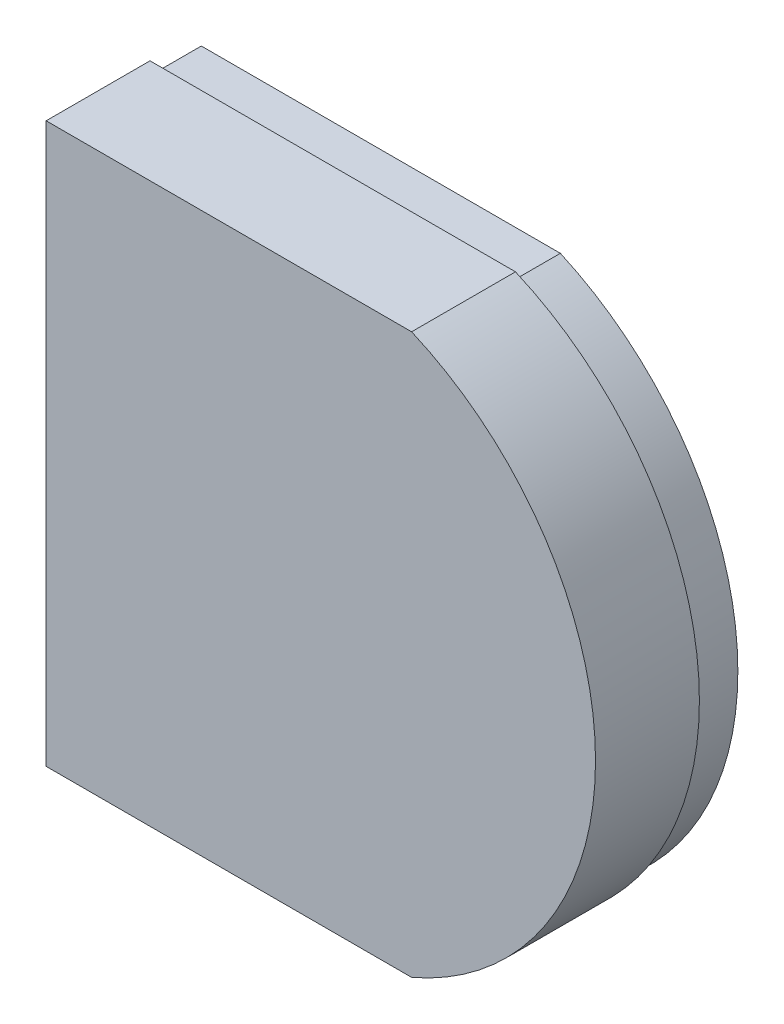
ISO-10303-21;
HEADER;
FILE_DESCRIPTION(('STEP AP214'),'2;1');
FILE_NAME('part.step','',(''),(''),'','','');
FILE_SCHEMA(('AUTOMOTIVE_DESIGN { 1 0 10303 214 1 1 1 1 }'));
ENDSEC;
DATA;
#1=APPLICATION_CONTEXT('core data for automotive mechanical design processes');
#2=APPLICATION_PROTOCOL_DEFINITION('international standard','automotive_design',2000,#1);
#3=PRODUCT_CONTEXT('',#1,'mechanical');
#4=PRODUCT('Part','Part','',(#3));
#5=PRODUCT_RELATED_PRODUCT_CATEGORY('part','',(#4));
#6=PRODUCT_DEFINITION_FORMATION('','',#4);
#7=PRODUCT_DEFINITION_CONTEXT('part definition',#1,'design');
#8=PRODUCT_DEFINITION('design','',#6,#7);
#9=PRODUCT_DEFINITION_SHAPE('','',#8);
#10=(LENGTH_UNIT() NAMED_UNIT(*) SI_UNIT(.MILLI.,.METRE.));
#11=(NAMED_UNIT(*) PLANE_ANGLE_UNIT() SI_UNIT($,.RADIAN.));
#12=(NAMED_UNIT(*) SI_UNIT($,.STERADIAN.) SOLID_ANGLE_UNIT());
#13=UNCERTAINTY_MEASURE_WITH_UNIT(LENGTH_MEASURE(1.E-05),#10,'distance_accuracy_value','');
#14=(GEOMETRIC_REPRESENTATION_CONTEXT(3) GLOBAL_UNCERTAINTY_ASSIGNED_CONTEXT((#13)) GLOBAL_UNIT_ASSIGNED_CONTEXT((#10,
#11,#12)) REPRESENTATION_CONTEXT('',''));
#15=CARTESIAN_POINT('',(0.,0.,0.));
#16=DIRECTION('',(0.,0.,1.));
#17=DIRECTION('',(1.,0.,0.));
#18=AXIS2_PLACEMENT_3D('',#15,#16,#17);
#19=CARTESIAN_POINT('',(0.,0.,-0.999999999999997));
#20=DIRECTION('',(0.,0.,1.));
#21=DIRECTION('',(1.,0.,0.));
#22=AXIS2_PLACEMENT_3D('',#19,#20,#21);
#23=PLANE('',#22);
#24=DIRECTION('',(-1.,0.,0.));
#25=VECTOR('',#24,1.);
#26=CARTESIAN_POINT('',(0.,4.9275323293826,-0.999999999999997));
#27=LINE('',#26,#25);
#28=CARTESIAN_POINT('',(-49.3887594092479,4.92753232938259,-0.999999999999997));
#29=VERTEX_POINT('',#28);
#30=CARTESIAN_POINT('',(-76.8887594092479,4.9275323293826,-0.999999999999997));
#31=VERTEX_POINT('',#30);
#32=EDGE_CURVE('E11',#29,#31,#27,.T.);
#33=ORIENTED_EDGE('',*,*,#32,.F.);
#34=CARTESIAN_POINT('',(-58.9321060057239,25.7275323293826,-0.999999999999997));
#35=DIRECTION('',(0.,0.,1.));
#36=DIRECTION('',(1.,0.,0.));
#37=AXIS2_PLACEMENT_3D('',#34,#35,#36);
#38=CIRCLE('',#37,22.8848304398453);
#39=CARTESIAN_POINT('',(-49.3887594092479,46.5275323293826,-0.999999999999997));
#40=VERTEX_POINT('',#39);
#41=EDGE_CURVE('E43',#40,#29,#38,.F.);
#42=ORIENTED_EDGE('',*,*,#41,.F.);
#43=DIRECTION('',(-1.,0.,0.));
#44=VECTOR('',#43,1.);
#45=CARTESIAN_POINT('',(0.,46.5275323293826,-0.999999999999997));
#46=LINE('',#45,#44);
#47=CARTESIAN_POINT('',(-76.8887594092479,46.5275323293826,-0.999999999999997));
#48=VERTEX_POINT('',#47);
#49=EDGE_CURVE('E214',#40,#48,#46,.T.);
#50=ORIENTED_EDGE('',*,*,#49,.T.);
#51=DIRECTION('',(0.,1.,0.));
#52=VECTOR('',#51,1.);
#53=CARTESIAN_POINT('',(-76.8887594092479,0.,-0.999999999999997));
#54=LINE('',#53,#52);
#55=EDGE_CURVE('E207',#31,#48,#54,.T.);
#56=ORIENTED_EDGE('',*,*,#55,.F.);
#57=EDGE_LOOP('',(#33,#42,#50,#56));
#58=FACE_BOUND('',#57,.T.);
#59=CARTESIAN_POINT('',(-58.8567950613397,25.7275323293826,-0.999999999999997));
#60=DIRECTION('',(0.,0.,-1.));
#61=DIRECTION('',(-1.,0.,0.));
#62=AXIS2_PLACEMENT_3D('',#59,#60,#61);
#63=CIRCLE('',#62,23.3095194954611);
#64=CARTESIAN_POINT('',(-49.3887594092479,47.0275323293826,-0.999999999999997));
#65=VERTEX_POINT('',#64);
#66=CARTESIAN_POINT('',(-49.3887594092479,4.42753232938259,-0.999999999999997));
#67=VERTEX_POINT('',#66);
#68=EDGE_CURVE('E156',#65,#67,#63,.T.);
#69=ORIENTED_EDGE('',*,*,#68,.T.);
#70=DIRECTION('',(-1.,0.,0.));
#71=VECTOR('',#70,1.);
#72=CARTESIAN_POINT('',(-49.3887594092479,4.42753232938259,-0.999999999999997));
#73=LINE('',#72,#71);
#74=CARTESIAN_POINT('',(-77.3887594092479,4.42753232938259,-0.999999999999997));
#75=VERTEX_POINT('',#74);
#76=EDGE_CURVE('E130',#67,#75,#73,.T.);
#77=ORIENTED_EDGE('',*,*,#76,.T.);
#78=DIRECTION('',(0.,1.,0.));
#79=VECTOR('',#78,1.);
#80=CARTESIAN_POINT('',(-77.3887594092479,4.42753232938259,-0.999999999999997));
#81=LINE('',#80,#79);
#82=CARTESIAN_POINT('',(-77.3887594092479,47.0275323293826,-0.999999999999997));
#83=VERTEX_POINT('',#82);
#84=EDGE_CURVE('E50',#75,#83,#81,.T.);
#85=ORIENTED_EDGE('',*,*,#84,.T.);
#86=DIRECTION('',(1.,0.,0.));
#87=VECTOR('',#86,1.);
#88=CARTESIAN_POINT('',(-77.3887594092479,47.0275323293826,-0.999999999999997));
#89=LINE('',#88,#87);
#90=EDGE_CURVE('E149',#83,#65,#89,.T.);
#91=ORIENTED_EDGE('',*,*,#90,.T.);
#92=EDGE_LOOP('',(#69,#77,#85,#91));
#93=FACE_BOUND('',#92,.T.);
#94=ADVANCED_FACE('F35',(#58,#93),#23,.F.);
#95=CARTESIAN_POINT('',(-76.8887594092479,4.9275323293826,9.));
#96=DIRECTION('',(0.,1.,0.));
#97=DIRECTION('',(0.,0.,1.));
#98=AXIS2_PLACEMENT_3D('',#95,#96,#97);
#99=PLANE('',#98);
#100=ORIENTED_EDGE('',*,*,#32,.T.);
#101=DIRECTION('',(0.,0.,-1.));
#102=VECTOR('',#101,1.);
#103=CARTESIAN_POINT('',(-76.8887594092479,4.9275323293826,9.));
#104=LINE('',#103,#102);
#105=CARTESIAN_POINT('',(-76.8887594092479,4.9275323293826,9.));
#106=VERTEX_POINT('',#105);
#107=EDGE_CURVE('E181',#106,#31,#104,.T.);
#108=ORIENTED_EDGE('',*,*,#107,.F.);
#109=DIRECTION('',(1.,0.,0.));
#110=VECTOR('',#109,1.);
#111=CARTESIAN_POINT('',(-76.8887594092479,4.9275323293826,9.));
#112=LINE('',#111,#110);
#113=CARTESIAN_POINT('',(-49.3887594092479,4.92753232938259,9.));
#114=VERTEX_POINT('',#113);
#115=EDGE_CURVE('E171',#106,#114,#112,.T.);
#116=ORIENTED_EDGE('',*,*,#115,.T.);
#117=DIRECTION('',(0.,0.,-1.));
#118=VECTOR('',#117,1.);
#119=CARTESIAN_POINT('',(-49.3887594092479,4.92753232938259,9.));
#120=LINE('',#119,#118);
#121=EDGE_CURVE('E189',#114,#29,#120,.T.);
#122=ORIENTED_EDGE('',*,*,#121,.T.);
#123=EDGE_LOOP('',(#100,#108,#116,#122));
#124=FACE_BOUND('',#123,.T.);
#125=ADVANCED_FACE('F224',(#124),#99,.T.);
#126=CARTESIAN_POINT('',(-58.9321060057239,25.7275323293826,9.));
#127=DIRECTION('',(0.,0.,-1.));
#128=DIRECTION('',(-1.,0.,0.));
#129=AXIS2_PLACEMENT_3D('',#126,#127,#128);
#130=CYLINDRICAL_SURFACE('',#129,22.8848304398453);
#131=ORIENTED_EDGE('',*,*,#41,.T.);
#132=ORIENTED_EDGE('',*,*,#121,.F.);
#133=CARTESIAN_POINT('',(-58.9321060057239,25.7275323293826,9.));
#134=DIRECTION('',(0.,0.,1.));
#135=DIRECTION('',(1.,0.,0.));
#136=AXIS2_PLACEMENT_3D('',#133,#134,#135);
#137=CIRCLE('',#136,22.8848304398453);
#138=CARTESIAN_POINT('',(-49.3887594092479,46.5275323293826,9.));
#139=VERTEX_POINT('',#138);
#140=EDGE_CURVE('E174',#114,#139,#137,.T.);
#141=ORIENTED_EDGE('',*,*,#140,.T.);
#142=DIRECTION('',(0.,0.,-1.));
#143=VECTOR('',#142,1.);
#144=CARTESIAN_POINT('',(-49.3887594092479,46.5275323293826,9.));
#145=LINE('',#144,#143);
#146=EDGE_CURVE('E186',#139,#40,#145,.T.);
#147=ORIENTED_EDGE('',*,*,#146,.T.);
#148=EDGE_LOOP('',(#131,#132,#141,#147));
#149=FACE_BOUND('',#148,.T.);
#150=ADVANCED_FACE('F219',(#149),#130,.F.);
#151=CARTESIAN_POINT('',(-76.8887594092479,46.5275323293826,9.));
#152=DIRECTION('',(0.,1.,0.));
#153=DIRECTION('',(0.,0.,1.));
#154=AXIS2_PLACEMENT_3D('',#151,#152,#153);
#155=PLANE('',#154);
#156=ORIENTED_EDGE('',*,*,#146,.F.);
#157=DIRECTION('',(1.,0.,0.));
#158=VECTOR('',#157,1.);
#159=CARTESIAN_POINT('',(-76.8887594092479,46.5275323293826,9.));
#160=LINE('',#159,#158);
#161=CARTESIAN_POINT('',(-76.8887594092479,46.5275323293826,9.));
#162=VERTEX_POINT('',#161);
#163=EDGE_CURVE('E176',#162,#139,#160,.T.);
#164=ORIENTED_EDGE('',*,*,#163,.F.);
#165=DIRECTION('',(0.,0.,-1.));
#166=VECTOR('',#165,1.);
#167=CARTESIAN_POINT('',(-76.8887594092479,46.5275323293826,9.));
#168=LINE('',#167,#166);
#169=EDGE_CURVE('E183',#162,#48,#168,.T.);
#170=ORIENTED_EDGE('',*,*,#169,.T.);
#171=ORIENTED_EDGE('',*,*,#49,.F.);
#172=EDGE_LOOP('',(#156,#164,#170,#171));
#173=FACE_BOUND('',#172,.T.);
#174=ADVANCED_FACE('F234',(#173),#155,.F.);
#175=CARTESIAN_POINT('',(-76.8887594092479,46.5275323293826,9.));
#176=DIRECTION('',(1.,0.,0.));
#177=DIRECTION('',(0.,0.,-1.));
#178=AXIS2_PLACEMENT_3D('',#175,#176,#177);
#179=PLANE('',#178);
#180=ORIENTED_EDGE('',*,*,#55,.T.);
#181=ORIENTED_EDGE('',*,*,#169,.F.);
#182=DIRECTION('',(0.,-1.,0.));
#183=VECTOR('',#182,1.);
#184=CARTESIAN_POINT('',(-76.8887594092479,46.5275323293826,9.));
#185=LINE('',#184,#183);
#186=EDGE_CURVE('E179',#162,#106,#185,.T.);
#187=ORIENTED_EDGE('',*,*,#186,.T.);
#188=ORIENTED_EDGE('',*,*,#107,.T.);
#189=EDGE_LOOP('',(#180,#181,#187,#188));
#190=FACE_BOUND('',#189,.T.);
#191=ADVANCED_FACE('F230',(#190),#179,.T.);
#192=CARTESIAN_POINT('',(-58.9321060057239,25.7275323293826,9.));
#193=DIRECTION('',(0.,0.,1.));
#194=DIRECTION('',(1.,0.,0.));
#195=AXIS2_PLACEMENT_3D('',#192,#193,#194);
#196=PLANE('',#195);
#197=ORIENTED_EDGE('',*,*,#115,.F.);
#198=ORIENTED_EDGE('',*,*,#186,.F.);
#199=ORIENTED_EDGE('',*,*,#163,.T.);
#200=ORIENTED_EDGE('',*,*,#140,.F.);
#201=EDGE_LOOP('',(#197,#198,#199,#200));
#202=FACE_BOUND('',#201,.T.);
#203=ADVANCED_FACE('F236',(#202),#196,.F.);
#204=CARTESIAN_POINT('',(-58.7867353828083,25.7275323293826,2.5));
#205=DIRECTION('',(0.,0.,-1.));
#206=DIRECTION('',(-1.,0.,0.));
#207=AXIS2_PLACEMENT_3D('',#204,#205,#206);
#208=PLANE('',#207);
#209=DIRECTION('',(1.,0.,0.));
#210=VECTOR('',#209,1.);
#211=CARTESIAN_POINT('',(-77.3887594092479,47.0275323293826,2.5));
#212=LINE('',#211,#210);
#213=CARTESIAN_POINT('',(-77.3887594092479,47.0275323293826,2.5));
#214=VERTEX_POINT('',#213);
#215=CARTESIAN_POINT('',(-49.3887594092479,47.0275323293826,2.5));
#216=VERTEX_POINT('',#215);
#217=EDGE_CURVE('E136',#214,#216,#212,.T.);
#218=ORIENTED_EDGE('',*,*,#217,.F.);
#219=DIRECTION('',(0.,1.,0.));
#220=VECTOR('',#219,1.);
#221=CARTESIAN_POINT('',(-77.3887594092479,4.42753232938259,2.5));
#222=LINE('',#221,#220);
#223=CARTESIAN_POINT('',(-77.3887594092479,4.42753232938259,2.5));
#224=VERTEX_POINT('',#223);
#225=EDGE_CURVE('E145',#224,#214,#222,.T.);
#226=ORIENTED_EDGE('',*,*,#225,.F.);
#227=DIRECTION('',(-1.,0.,0.));
#228=VECTOR('',#227,1.);
#229=CARTESIAN_POINT('',(-49.3887594092479,4.42753232938259,2.5));
#230=LINE('',#229,#228);
#231=CARTESIAN_POINT('',(-49.3887594092479,4.42753232938259,2.5));
#232=VERTEX_POINT('',#231);
#233=EDGE_CURVE('E128',#232,#224,#230,.T.);
#234=ORIENTED_EDGE('',*,*,#233,.F.);
#235=CARTESIAN_POINT('',(-58.8567950613397,25.7275323293826,2.5));
#236=DIRECTION('',(0.,0.,-1.));
#237=DIRECTION('',(-1.,0.,0.));
#238=AXIS2_PLACEMENT_3D('',#235,#236,#237);
#239=CIRCLE('',#238,23.3095194954611);
#240=EDGE_CURVE('E142',#216,#232,#239,.T.);
#241=ORIENTED_EDGE('',*,*,#240,.F.);
#242=EDGE_LOOP('',(#218,#226,#234,#241));
#243=FACE_BOUND('',#242,.T.);
#244=CARTESIAN_POINT('',(-58.7867353828083,25.7275323293826,2.5));
#245=DIRECTION('',(0.,0.,-1.));
#246=DIRECTION('',(-1.,0.,0.));
#247=AXIS2_PLACEMENT_3D('',#244,#245,#246);
#248=CIRCLE('',#247,23.7394598169297);
#249=CARTESIAN_POINT('',(-49.3887594092479,47.5275323293826,2.5));
#250=VERTEX_POINT('',#249);
#251=CARTESIAN_POINT('',(-49.3887594092479,3.9275323293826,2.5));
#252=VERTEX_POINT('',#251);
#253=EDGE_CURVE('E161',#250,#252,#248,.T.);
#254=ORIENTED_EDGE('',*,*,#253,.T.);
#255=DIRECTION('',(-1.,0.,0.));
#256=VECTOR('',#255,1.);
#257=CARTESIAN_POINT('',(-77.8887594092479,3.9275323293826,2.5));
#258=LINE('',#257,#256);
#259=CARTESIAN_POINT('',(-77.8887594092479,3.9275323293826,2.5));
#260=VERTEX_POINT('',#259);
#261=EDGE_CURVE('E166',#252,#260,#258,.T.);
#262=ORIENTED_EDGE('',*,*,#261,.T.);
#263=DIRECTION('',(0.,1.,0.));
#264=VECTOR('',#263,1.);
#265=CARTESIAN_POINT('',(-77.8887594092479,47.5275323293826,2.5));
#266=LINE('',#265,#264);
#267=CARTESIAN_POINT('',(-77.8887594092479,47.5275323293826,2.5));
#268=VERTEX_POINT('',#267);
#269=EDGE_CURVE('E58',#260,#268,#266,.T.);
#270=ORIENTED_EDGE('',*,*,#269,.T.);
#271=DIRECTION('',(1.,0.,0.));
#272=VECTOR('',#271,1.);
#273=CARTESIAN_POINT('',(-49.3887594092479,47.5275323293826,2.5));
#274=LINE('',#273,#272);
#275=EDGE_CURVE('E169',#268,#250,#274,.T.);
#276=ORIENTED_EDGE('',*,*,#275,.T.);
#277=EDGE_LOOP('',(#254,#262,#270,#276));
#278=FACE_BOUND('',#277,.T.);
#279=ADVANCED_FACE('F141',(#243,#278),#208,.T.);
#280=CARTESIAN_POINT('',(-58.8567950613397,25.7275323293826,2.5));
#281=DIRECTION('',(0.,0.,-1.));
#282=DIRECTION('',(-1.,0.,0.));
#283=AXIS2_PLACEMENT_3D('',#280,#281,#282);
#284=CYLINDRICAL_SURFACE('',#283,23.3095194954611);
#285=ORIENTED_EDGE('',*,*,#68,.F.);
#286=DIRECTION('',(0.,0.,-1.));
#287=VECTOR('',#286,1.);
#288=CARTESIAN_POINT('',(-49.3887594092479,47.0275323293826,2.5));
#289=LINE('',#288,#287);
#290=EDGE_CURVE('E148',#216,#65,#289,.T.);
#291=ORIENTED_EDGE('',*,*,#290,.F.);
#292=ORIENTED_EDGE('',*,*,#240,.T.);
#293=DIRECTION('',(0.,0.,-1.));
#294=VECTOR('',#293,1.);
#295=CARTESIAN_POINT('',(-49.3887594092479,4.42753232938259,2.5));
#296=LINE('',#295,#294);
#297=EDGE_CURVE('E125',#232,#67,#296,.T.);
#298=ORIENTED_EDGE('',*,*,#297,.T.);
#299=EDGE_LOOP('',(#285,#291,#292,#298));
#300=FACE_BOUND('',#299,.T.);
#301=ADVANCED_FACE('F147',(#300),#284,.T.);
#302=CARTESIAN_POINT('',(-77.3887594092479,47.0275323293826,2.5));
#303=DIRECTION('',(0.,1.,0.));
#304=DIRECTION('',(0.,0.,1.));
#305=AXIS2_PLACEMENT_3D('',#302,#303,#304);
#306=PLANE('',#305);
#307=ORIENTED_EDGE('',*,*,#90,.F.);
#308=DIRECTION('',(0.,0.,-1.));
#309=VECTOR('',#308,1.);
#310=CARTESIAN_POINT('',(-77.3887594092479,47.0275323293826,2.5));
#311=LINE('',#310,#309);
#312=EDGE_CURVE('E162',#214,#83,#311,.T.);
#313=ORIENTED_EDGE('',*,*,#312,.F.);
#314=ORIENTED_EDGE('',*,*,#217,.T.);
#315=ORIENTED_EDGE('',*,*,#290,.T.);
#316=EDGE_LOOP('',(#307,#313,#314,#315));
#317=FACE_BOUND('',#316,.T.);
#318=ADVANCED_FACE('F313',(#317),#306,.T.);
#319=CARTESIAN_POINT('',(-77.3887594092479,4.42753232938259,2.5));
#320=DIRECTION('',(-1.,0.,0.));
#321=DIRECTION('',(0.,0.,1.));
#322=AXIS2_PLACEMENT_3D('',#319,#320,#321);
#323=PLANE('',#322);
#324=ORIENTED_EDGE('',*,*,#84,.F.);
#325=DIRECTION('',(0.,0.,-1.));
#326=VECTOR('',#325,1.);
#327=CARTESIAN_POINT('',(-77.3887594092479,4.42753232938259,2.5));
#328=LINE('',#327,#326);
#329=EDGE_CURVE('E135',#224,#75,#328,.T.);
#330=ORIENTED_EDGE('',*,*,#329,.F.);
#331=ORIENTED_EDGE('',*,*,#225,.T.);
#332=ORIENTED_EDGE('',*,*,#312,.T.);
#333=EDGE_LOOP('',(#324,#330,#331,#332));
#334=FACE_BOUND('',#333,.T.);
#335=ADVANCED_FACE('F304',(#334),#323,.T.);
#336=CARTESIAN_POINT('',(-49.3887594092479,4.42753232938259,2.5));
#337=DIRECTION('',(0.,-1.,0.));
#338=DIRECTION('',(0.,0.,-1.));
#339=AXIS2_PLACEMENT_3D('',#336,#337,#338);
#340=PLANE('',#339);
#341=ORIENTED_EDGE('',*,*,#76,.F.);
#342=ORIENTED_EDGE('',*,*,#297,.F.);
#343=ORIENTED_EDGE('',*,*,#233,.T.);
#344=ORIENTED_EDGE('',*,*,#329,.T.);
#345=EDGE_LOOP('',(#341,#342,#343,#344));
#346=FACE_BOUND('',#345,.T.);
#347=ADVANCED_FACE('F127',(#346),#340,.T.);
#348=CARTESIAN_POINT('',(0.,0.,10.6));
#349=DIRECTION('',(0.,0.,1.));
#350=DIRECTION('',(1.,0.,0.));
#351=AXIS2_PLACEMENT_3D('',#348,#349,#350);
#352=PLANE('',#351);
#353=CARTESIAN_POINT('',(-58.7867353828083,25.7275323293826,10.6));
#354=DIRECTION('',(0.,0.,1.));
#355=DIRECTION('',(1.,0.,0.));
#356=AXIS2_PLACEMENT_3D('',#353,#354,#355);
#357=CIRCLE('',#356,23.7394598169297);
#358=CARTESIAN_POINT('',(-49.3887594092479,47.5275323293826,10.6));
#359=VERTEX_POINT('',#358);
#360=CARTESIAN_POINT('',(-49.3887594092479,3.9275323293826,10.6));
#361=VERTEX_POINT('',#360);
#362=EDGE_CURVE('E192',#359,#361,#357,.F.);
#363=ORIENTED_EDGE('',*,*,#362,.F.);
#364=DIRECTION('',(1.,0.,0.));
#365=VECTOR('',#364,1.);
#366=CARTESIAN_POINT('',(0.,47.5275323293826,10.6));
#367=LINE('',#366,#365);
#368=CARTESIAN_POINT('',(-77.8887594092479,47.5275323293826,10.6));
#369=VERTEX_POINT('',#368);
#370=EDGE_CURVE('E195',#369,#359,#367,.T.);
#371=ORIENTED_EDGE('',*,*,#370,.F.);
#372=DIRECTION('',(0.,-1.,0.));
#373=VECTOR('',#372,1.);
#374=CARTESIAN_POINT('',(-77.8887594092479,0.,10.6));
#375=LINE('',#374,#373);
#376=CARTESIAN_POINT('',(-77.8887594092479,3.9275323293826,10.6));
#377=VERTEX_POINT('',#376);
#378=EDGE_CURVE('E198',#369,#377,#375,.T.);
#379=ORIENTED_EDGE('',*,*,#378,.T.);
#380=DIRECTION('',(1.,0.,0.));
#381=VECTOR('',#380,1.);
#382=CARTESIAN_POINT('',(0.,3.9275323293826,10.6));
#383=LINE('',#382,#381);
#384=EDGE_CURVE('E201',#377,#361,#383,.T.);
#385=ORIENTED_EDGE('',*,*,#384,.T.);
#386=EDGE_LOOP('',(#363,#371,#379,#385));
#387=FACE_BOUND('',#386,.T.);
#388=ADVANCED_FACE('F253',(#387),#352,.T.);
#389=CARTESIAN_POINT('',(0.,47.5275323293826,-0.999999999999997));
#390=DIRECTION('',(0.,-1.,0.));
#391=DIRECTION('',(1.,0.,0.));
#392=AXIS2_PLACEMENT_3D('',#389,#390,#391);
#393=PLANE('',#392);
#394=ORIENTED_EDGE('',*,*,#275,.F.);
#395=DIRECTION('',(0.,0.,1.));
#396=VECTOR('',#395,1.);
#397=CARTESIAN_POINT('',(-77.8887594092479,47.5275323293826,-0.999999999999997));
#398=LINE('',#397,#396);
#399=EDGE_CURVE('E210',#268,#369,#398,.T.);
#400=ORIENTED_EDGE('',*,*,#399,.T.);
#401=ORIENTED_EDGE('',*,*,#370,.T.);
#402=DIRECTION('',(0.,0.,1.));
#403=VECTOR('',#402,1.);
#404=CARTESIAN_POINT('',(-49.3887594092479,47.5275323293826,-0.999999999999997));
#405=LINE('',#404,#403);
#406=EDGE_CURVE('E204',#250,#359,#405,.T.);
#407=ORIENTED_EDGE('',*,*,#406,.F.);
#408=EDGE_LOOP('',(#394,#400,#401,#407));
#409=FACE_BOUND('',#408,.T.);
#410=ADVANCED_FACE('F260',(#409),#393,.F.);
#411=CARTESIAN_POINT('',(-77.8887594092479,0.,-0.999999999999997));
#412=DIRECTION('',(-1.,0.,0.));
#413=DIRECTION('',(0.,0.,1.));
#414=AXIS2_PLACEMENT_3D('',#411,#412,#413);
#415=PLANE('',#414);
#416=ORIENTED_EDGE('',*,*,#399,.F.);
#417=ORIENTED_EDGE('',*,*,#269,.F.);
#418=DIRECTION('',(0.,0.,1.));
#419=VECTOR('',#418,1.);
#420=CARTESIAN_POINT('',(-77.8887594092479,3.9275323293826,-0.999999999999997));
#421=LINE('',#420,#419);
#422=EDGE_CURVE('E208',#260,#377,#421,.T.);
#423=ORIENTED_EDGE('',*,*,#422,.T.);
#424=ORIENTED_EDGE('',*,*,#378,.F.);
#425=EDGE_LOOP('',(#416,#417,#423,#424));
#426=FACE_BOUND('',#425,.T.);
#427=ADVANCED_FACE('F257',(#426),#415,.T.);
#428=CARTESIAN_POINT('',(0.,3.9275323293826,-0.999999999999997));
#429=DIRECTION('',(0.,-1.,0.));
#430=DIRECTION('',(0.,0.,-1.));
#431=AXIS2_PLACEMENT_3D('',#428,#429,#430);
#432=PLANE('',#431);
#433=ORIENTED_EDGE('',*,*,#422,.F.);
#434=ORIENTED_EDGE('',*,*,#261,.F.);
#435=DIRECTION('',(0.,0.,1.));
#436=VECTOR('',#435,1.);
#437=CARTESIAN_POINT('',(-49.3887594092479,3.9275323293826,-0.999999999999997));
#438=LINE('',#437,#436);
#439=EDGE_CURVE('E205',#252,#361,#438,.T.);
#440=ORIENTED_EDGE('',*,*,#439,.T.);
#441=ORIENTED_EDGE('',*,*,#384,.F.);
#442=EDGE_LOOP('',(#433,#434,#440,#441));
#443=FACE_BOUND('',#442,.T.);
#444=ADVANCED_FACE('F254',(#443),#432,.T.);
#445=CARTESIAN_POINT('',(-58.7867353828083,25.7275323293826,-0.999999999999997));
#446=DIRECTION('',(0.,0.,1.));
#447=DIRECTION('',(1.,0.,0.));
#448=AXIS2_PLACEMENT_3D('',#445,#446,#447);
#449=CYLINDRICAL_SURFACE('',#448,23.7394598169297);
#450=ORIENTED_EDGE('',*,*,#253,.F.);
#451=ORIENTED_EDGE('',*,*,#406,.T.);
#452=ORIENTED_EDGE('',*,*,#362,.T.);
#453=ORIENTED_EDGE('',*,*,#439,.F.);
#454=EDGE_LOOP('',(#450,#451,#452,#453));
#455=FACE_BOUND('',#454,.T.);
#456=ADVANCED_FACE('F37',(#455),#449,.T.);
#457=CLOSED_SHELL('',(#94,#125,#150,#174,#191,#203,#279,#301,#318,#335,#347,#388,#410,#427,#444,#456));
#458=MANIFOLD_SOLID_BREP('B2',#457);
#459=ADVANCED_BREP_SHAPE_REPRESENTATION('',(#18,#458),#14);
#460=SHAPE_DEFINITION_REPRESENTATION(#9,#459);
ENDSEC;
END-ISO-10303-21;
